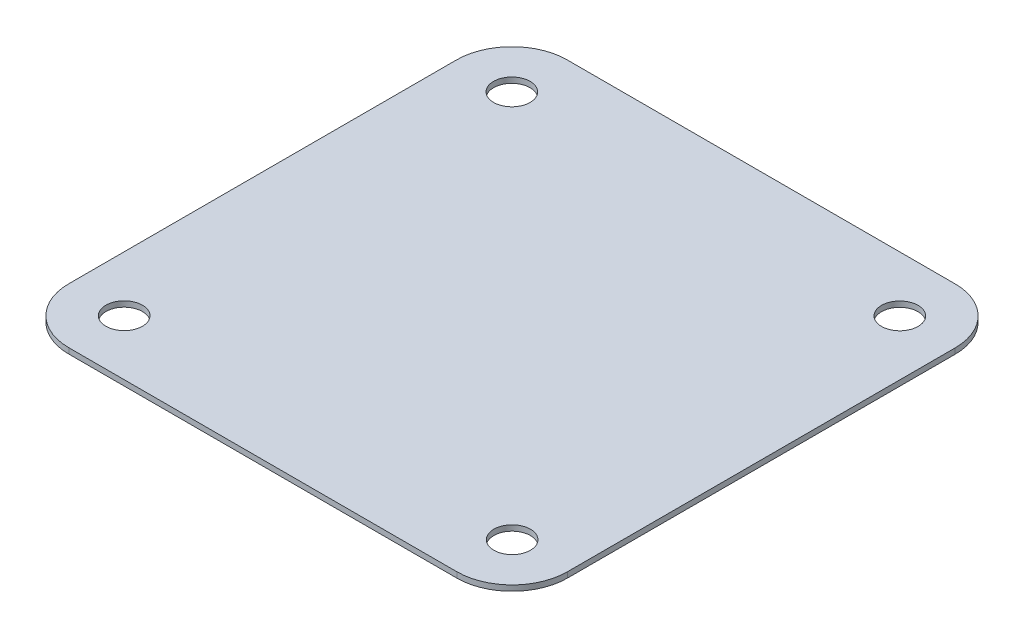
ISO-10303-21;
HEADER;
FILE_DESCRIPTION(('STEP AP214'),'2;1');
FILE_NAME('part.step','',(''),(''),'','','');
FILE_SCHEMA(('AUTOMOTIVE_DESIGN { 1 0 10303 214 1 1 1 1 }'));
ENDSEC;
DATA;
#1=APPLICATION_CONTEXT('core data for automotive mechanical design processes');
#2=APPLICATION_PROTOCOL_DEFINITION('international standard','automotive_design',2000,#1);
#3=PRODUCT_CONTEXT('',#1,'mechanical');
#4=PRODUCT('Part','Part','',(#3));
#5=PRODUCT_RELATED_PRODUCT_CATEGORY('part','',(#4));
#6=PRODUCT_DEFINITION_FORMATION('','',#4);
#7=PRODUCT_DEFINITION_CONTEXT('part definition',#1,'design');
#8=PRODUCT_DEFINITION('design','',#6,#7);
#9=PRODUCT_DEFINITION_SHAPE('','',#8);
#10=(LENGTH_UNIT() NAMED_UNIT(*) SI_UNIT(.MILLI.,.METRE.));
#11=(NAMED_UNIT(*) PLANE_ANGLE_UNIT() SI_UNIT($,.RADIAN.));
#12=(NAMED_UNIT(*) SI_UNIT($,.STERADIAN.) SOLID_ANGLE_UNIT());
#13=UNCERTAINTY_MEASURE_WITH_UNIT(LENGTH_MEASURE(1.E-05),#10,'distance_accuracy_value','');
#14=(GEOMETRIC_REPRESENTATION_CONTEXT(3) GLOBAL_UNCERTAINTY_ASSIGNED_CONTEXT((#13)) GLOBAL_UNIT_ASSIGNED_CONTEXT((#10,
#11,#12)) REPRESENTATION_CONTEXT('',''));
#15=CARTESIAN_POINT('',(0.,0.,0.));
#16=DIRECTION('',(0.,0.,1.));
#17=DIRECTION('',(1.,0.,0.));
#18=AXIS2_PLACEMENT_3D('',#15,#16,#17);
#19=CARTESIAN_POINT('',(-17.5126870222207,60.,17.5));
#20=DIRECTION('',(0.,-1.,0.));
#21=DIRECTION('',(0.,0.,-1.));
#22=AXIS2_PLACEMENT_3D('',#19,#20,#21);
#23=CYLINDRICAL_SURFACE('',#22,5.);
#24=CARTESIAN_POINT('',(-17.5126870222207,59.5,17.5));
#25=DIRECTION('',(0.,1.,0.));
#26=DIRECTION('',(0.,0.,1.));
#27=AXIS2_PLACEMENT_3D('',#24,#25,#26);
#28=CIRCLE('',#27,5.);
#29=CARTESIAN_POINT('',(-17.5126870222207,59.5,22.5));
#30=VERTEX_POINT('',#29);
#31=CARTESIAN_POINT('',(-22.5126870222207,59.5,17.5));
#32=VERTEX_POINT('',#31);
#33=EDGE_CURVE('E104',#30,#32,#28,.F.);
#34=ORIENTED_EDGE('',*,*,#33,.F.);
#35=DIRECTION('',(0.,-1.,0.));
#36=VECTOR('',#35,1.);
#37=CARTESIAN_POINT('',(-17.5126870222207,60.,22.5));
#38=LINE('',#37,#36);
#39=CARTESIAN_POINT('',(-17.5126870222207,60.,22.5));
#40=VERTEX_POINT('',#39);
#41=EDGE_CURVE('E115',#40,#30,#38,.T.);
#42=ORIENTED_EDGE('',*,*,#41,.F.);
#43=CARTESIAN_POINT('',(-17.5126870222207,60.,17.5));
#44=DIRECTION('',(0.,-1.,0.));
#45=DIRECTION('',(0.,0.,-1.));
#46=AXIS2_PLACEMENT_3D('',#43,#44,#45);
#47=CIRCLE('',#46,5.);
#48=CARTESIAN_POINT('',(-22.5126870222207,60.,17.5));
#49=VERTEX_POINT('',#48);
#50=EDGE_CURVE('E11',#49,#40,#47,.F.);
#51=ORIENTED_EDGE('',*,*,#50,.F.);
#52=DIRECTION('',(0.,-1.,0.));
#53=VECTOR('',#52,1.);
#54=CARTESIAN_POINT('',(-22.5126870222207,60.,17.5));
#55=LINE('',#54,#53);
#56=EDGE_CURVE('E50',#32,#49,#55,.F.);
#57=ORIENTED_EDGE('',*,*,#56,.F.);
#58=EDGE_LOOP('',(#34,#42,#51,#57));
#59=FACE_BOUND('',#58,.T.);
#60=ADVANCED_FACE('F39',(#59),#23,.T.);
#61=CARTESIAN_POINT('',(17.5126870222207,60.,17.5));
#62=DIRECTION('',(0.,-1.,0.));
#63=DIRECTION('',(0.,0.,-1.));
#64=AXIS2_PLACEMENT_3D('',#61,#62,#63);
#65=CYLINDRICAL_SURFACE('',#64,5.);
#66=CARTESIAN_POINT('',(17.5126870222207,59.5,17.5));
#67=DIRECTION('',(0.,1.,0.));
#68=DIRECTION('',(0.,0.,1.));
#69=AXIS2_PLACEMENT_3D('',#66,#67,#68);
#70=CIRCLE('',#69,5.);
#71=CARTESIAN_POINT('',(22.5126870222207,59.5,17.5));
#72=VERTEX_POINT('',#71);
#73=CARTESIAN_POINT('',(17.5126870222207,59.5,22.5));
#74=VERTEX_POINT('',#73);
#75=EDGE_CURVE('E53',#72,#74,#70,.F.);
#76=ORIENTED_EDGE('',*,*,#75,.F.);
#77=DIRECTION('',(0.,-1.,0.));
#78=VECTOR('',#77,1.);
#79=CARTESIAN_POINT('',(22.5126870222207,60.,17.5));
#80=LINE('',#79,#78);
#81=CARTESIAN_POINT('',(22.5126870222207,60.,17.5));
#82=VERTEX_POINT('',#81);
#83=EDGE_CURVE('E126',#82,#72,#80,.T.);
#84=ORIENTED_EDGE('',*,*,#83,.F.);
#85=CARTESIAN_POINT('',(17.5126870222207,60.,17.5));
#86=DIRECTION('',(0.,-1.,0.));
#87=DIRECTION('',(0.,0.,-1.));
#88=AXIS2_PLACEMENT_3D('',#85,#86,#87);
#89=CIRCLE('',#88,5.);
#90=CARTESIAN_POINT('',(17.5126870222207,60.,22.5));
#91=VERTEX_POINT('',#90);
#92=EDGE_CURVE('E118',#91,#82,#89,.F.);
#93=ORIENTED_EDGE('',*,*,#92,.F.);
#94=DIRECTION('',(0.,-1.,0.));
#95=VECTOR('',#94,1.);
#96=CARTESIAN_POINT('',(17.5126870222207,60.,22.5));
#97=LINE('',#96,#95);
#98=EDGE_CURVE('E125',#74,#91,#97,.F.);
#99=ORIENTED_EDGE('',*,*,#98,.F.);
#100=EDGE_LOOP('',(#76,#84,#93,#99));
#101=FACE_BOUND('',#100,.T.);
#102=ADVANCED_FACE('F205',(#101),#65,.T.);
#103=CARTESIAN_POINT('',(-17.5126870222207,60.,-17.5));
#104=DIRECTION('',(0.,1.,0.));
#105=DIRECTION('',(0.,0.,1.));
#106=AXIS2_PLACEMENT_3D('',#103,#104,#105);
#107=CYLINDRICAL_SURFACE('',#106,5.);
#108=CARTESIAN_POINT('',(-17.5126870222207,59.5,-17.5));
#109=DIRECTION('',(0.,1.,0.));
#110=DIRECTION('',(0.,0.,1.));
#111=AXIS2_PLACEMENT_3D('',#108,#109,#110);
#112=CIRCLE('',#111,5.);
#113=CARTESIAN_POINT('',(-22.5126870222207,59.5,-17.5));
#114=VERTEX_POINT('',#113);
#115=CARTESIAN_POINT('',(-17.5126870222207,59.5,-22.5));
#116=VERTEX_POINT('',#115);
#117=EDGE_CURVE('E166',#114,#116,#112,.F.);
#118=ORIENTED_EDGE('',*,*,#117,.F.);
#119=DIRECTION('',(0.,1.,0.));
#120=VECTOR('',#119,1.);
#121=CARTESIAN_POINT('',(-22.5126870222207,60.,-17.5));
#122=LINE('',#121,#120);
#123=CARTESIAN_POINT('',(-22.5126870222207,60.,-17.5));
#124=VERTEX_POINT('',#123);
#125=EDGE_CURVE('E131',#124,#114,#122,.F.);
#126=ORIENTED_EDGE('',*,*,#125,.F.);
#127=CARTESIAN_POINT('',(-17.5126870222207,60.,-17.5));
#128=DIRECTION('',(0.,-1.,0.));
#129=DIRECTION('',(0.,0.,-1.));
#130=AXIS2_PLACEMENT_3D('',#127,#128,#129);
#131=CIRCLE('',#130,5.);
#132=CARTESIAN_POINT('',(-17.5126870222207,60.,-22.5));
#133=VERTEX_POINT('',#132);
#134=EDGE_CURVE('E128',#133,#124,#131,.F.);
#135=ORIENTED_EDGE('',*,*,#134,.F.);
#136=DIRECTION('',(0.,1.,0.));
#137=VECTOR('',#136,1.);
#138=CARTESIAN_POINT('',(-17.5126870222207,60.,-22.5));
#139=LINE('',#138,#137);
#140=EDGE_CURVE('E133',#116,#133,#139,.T.);
#141=ORIENTED_EDGE('',*,*,#140,.F.);
#142=EDGE_LOOP('',(#118,#126,#135,#141));
#143=FACE_BOUND('',#142,.T.);
#144=ADVANCED_FACE('F206',(#143),#107,.T.);
#145=CARTESIAN_POINT('',(17.5126870222207,60.,-17.5));
#146=DIRECTION('',(0.,-1.,0.));
#147=DIRECTION('',(0.,0.,-1.));
#148=AXIS2_PLACEMENT_3D('',#145,#146,#147);
#149=CYLINDRICAL_SURFACE('',#148,5.);
#150=CARTESIAN_POINT('',(17.5126870222207,59.5,-17.5));
#151=DIRECTION('',(0.,1.,0.));
#152=DIRECTION('',(0.,0.,1.));
#153=AXIS2_PLACEMENT_3D('',#150,#151,#152);
#154=CIRCLE('',#153,5.);
#155=CARTESIAN_POINT('',(17.5126870222207,59.5,-22.5));
#156=VERTEX_POINT('',#155);
#157=CARTESIAN_POINT('',(22.5126870222207,59.5,-17.5));
#158=VERTEX_POINT('',#157);
#159=EDGE_CURVE('E167',#156,#158,#154,.F.);
#160=ORIENTED_EDGE('',*,*,#159,.F.);
#161=DIRECTION('',(0.,-1.,0.));
#162=VECTOR('',#161,1.);
#163=CARTESIAN_POINT('',(17.5126870222207,60.,-22.5));
#164=LINE('',#163,#162);
#165=CARTESIAN_POINT('',(17.5126870222207,60.,-22.5));
#166=VERTEX_POINT('',#165);
#167=EDGE_CURVE('E138',#166,#156,#164,.T.);
#168=ORIENTED_EDGE('',*,*,#167,.F.);
#169=CARTESIAN_POINT('',(17.5126870222207,60.,-17.5));
#170=DIRECTION('',(0.,-1.,0.));
#171=DIRECTION('',(0.,0.,-1.));
#172=AXIS2_PLACEMENT_3D('',#169,#170,#171);
#173=CIRCLE('',#172,5.);
#174=CARTESIAN_POINT('',(22.5126870222207,60.,-17.5));
#175=VERTEX_POINT('',#174);
#176=EDGE_CURVE('E137',#175,#166,#173,.F.);
#177=ORIENTED_EDGE('',*,*,#176,.F.);
#178=DIRECTION('',(0.,-1.,0.));
#179=VECTOR('',#178,1.);
#180=CARTESIAN_POINT('',(22.5126870222207,60.,-17.5));
#181=LINE('',#180,#179);
#182=EDGE_CURVE('E140',#158,#175,#181,.F.);
#183=ORIENTED_EDGE('',*,*,#182,.F.);
#184=EDGE_LOOP('',(#160,#168,#177,#183));
#185=FACE_BOUND('',#184,.T.);
#186=ADVANCED_FACE('F212',(#185),#149,.T.);
#187=CARTESIAN_POINT('',(22.5126870222207,60.,22.5));
#188=DIRECTION('',(-1.,0.,0.));
#189=DIRECTION('',(0.,0.,1.));
#190=AXIS2_PLACEMENT_3D('',#187,#188,#189);
#191=PLANE('',#190);
#192=ORIENTED_EDGE('',*,*,#83,.T.);
#193=DIRECTION('',(0.,0.,-1.));
#194=VECTOR('',#193,1.);
#195=CARTESIAN_POINT('',(22.5126870222207,59.5,22.5));
#196=LINE('',#195,#194);
#197=EDGE_CURVE('E175',#72,#158,#196,.T.);
#198=ORIENTED_EDGE('',*,*,#197,.T.);
#199=ORIENTED_EDGE('',*,*,#182,.T.);
#200=DIRECTION('',(0.,0.,-1.));
#201=VECTOR('',#200,1.);
#202=CARTESIAN_POINT('',(22.5126870222207,60.,22.5));
#203=LINE('',#202,#201);
#204=EDGE_CURVE('E149',#82,#175,#203,.T.);
#205=ORIENTED_EDGE('',*,*,#204,.F.);
#206=EDGE_LOOP('',(#192,#198,#199,#205));
#207=FACE_BOUND('',#206,.T.);
#208=ADVANCED_FACE('F218',(#207),#191,.F.);
#209=CARTESIAN_POINT('',(-22.5126870222207,60.,-22.5));
#210=DIRECTION('',(0.,0.,1.));
#211=DIRECTION('',(1.,0.,0.));
#212=AXIS2_PLACEMENT_3D('',#209,#210,#211);
#213=PLANE('',#212);
#214=ORIENTED_EDGE('',*,*,#167,.T.);
#215=DIRECTION('',(-1.,0.,0.));
#216=VECTOR('',#215,1.);
#217=CARTESIAN_POINT('',(-22.5126870222207,59.5,-22.5));
#218=LINE('',#217,#216);
#219=EDGE_CURVE('E164',#156,#116,#218,.T.);
#220=ORIENTED_EDGE('',*,*,#219,.T.);
#221=ORIENTED_EDGE('',*,*,#140,.T.);
#222=DIRECTION('',(-1.,0.,0.));
#223=VECTOR('',#222,1.);
#224=CARTESIAN_POINT('',(-22.5126870222207,60.,-22.5));
#225=LINE('',#224,#223);
#226=EDGE_CURVE('E150',#166,#133,#225,.T.);
#227=ORIENTED_EDGE('',*,*,#226,.F.);
#228=EDGE_LOOP('',(#214,#220,#221,#227));
#229=FACE_BOUND('',#228,.T.);
#230=ADVANCED_FACE('F225',(#229),#213,.F.);
#231=CARTESIAN_POINT('',(-22.5126870222207,60.,22.5));
#232=DIRECTION('',(1.,0.,0.));
#233=DIRECTION('',(0.,0.,-1.));
#234=AXIS2_PLACEMENT_3D('',#231,#232,#233);
#235=PLANE('',#234);
#236=ORIENTED_EDGE('',*,*,#125,.T.);
#237=DIRECTION('',(0.,0.,1.));
#238=VECTOR('',#237,1.);
#239=CARTESIAN_POINT('',(-22.5126870222207,59.5,22.5));
#240=LINE('',#239,#238);
#241=EDGE_CURVE('E112',#114,#32,#240,.T.);
#242=ORIENTED_EDGE('',*,*,#241,.T.);
#243=ORIENTED_EDGE('',*,*,#56,.T.);
#244=DIRECTION('',(0.,0.,1.));
#245=VECTOR('',#244,1.);
#246=CARTESIAN_POINT('',(-22.5126870222207,60.,22.5));
#247=LINE('',#246,#245);
#248=EDGE_CURVE('E144',#124,#49,#247,.T.);
#249=ORIENTED_EDGE('',*,*,#248,.F.);
#250=EDGE_LOOP('',(#236,#242,#243,#249));
#251=FACE_BOUND('',#250,.T.);
#252=ADVANCED_FACE('F227',(#251),#235,.F.);
#253=CARTESIAN_POINT('',(-22.5126870222207,60.,22.5));
#254=DIRECTION('',(0.,0.,-1.));
#255=DIRECTION('',(-1.,0.,0.));
#256=AXIS2_PLACEMENT_3D('',#253,#254,#255);
#257=PLANE('',#256);
#258=ORIENTED_EDGE('',*,*,#41,.T.);
#259=DIRECTION('',(1.,0.,0.));
#260=VECTOR('',#259,1.);
#261=CARTESIAN_POINT('',(-22.5126870222207,59.5,22.5));
#262=LINE('',#261,#260);
#263=EDGE_CURVE('E103',#30,#74,#262,.T.);
#264=ORIENTED_EDGE('',*,*,#263,.T.);
#265=ORIENTED_EDGE('',*,*,#98,.T.);
#266=DIRECTION('',(1.,0.,0.));
#267=VECTOR('',#266,1.);
#268=CARTESIAN_POINT('',(-22.5126870222207,60.,22.5));
#269=LINE('',#268,#267);
#270=EDGE_CURVE('E117',#40,#91,#269,.T.);
#271=ORIENTED_EDGE('',*,*,#270,.F.);
#272=EDGE_LOOP('',(#258,#264,#265,#271));
#273=FACE_BOUND('',#272,.T.);
#274=ADVANCED_FACE('F116',(#273),#257,.F.);
#275=CARTESIAN_POINT('',(0.,60.,0.));
#276=DIRECTION('',(0.,-1.,0.));
#277=DIRECTION('',(0.,0.,-1.));
#278=AXIS2_PLACEMENT_3D('',#275,#276,#277);
#279=PLANE('',#278);
#280=CARTESIAN_POINT('',(17.5126870222207,60.,17.5));
#281=DIRECTION('',(0.,1.,0.));
#282=DIRECTION('',(0.,0.,-1.));
#283=AXIS2_PLACEMENT_3D('',#280,#281,#282);
#284=CIRCLE('',#283,1.65);
#285=CARTESIAN_POINT('',(17.5126870222207,60.,15.85));
#286=VERTEX_POINT('',#285);
#287=EDGE_CURVE('E162',#286,#286,#284,.T.);
#288=ORIENTED_EDGE('',*,*,#287,.F.);
#289=EDGE_LOOP('',(#288));
#290=FACE_BOUND('',#289,.T.);
#291=CARTESIAN_POINT('',(17.5126870222207,60.,-17.5));
#292=DIRECTION('',(0.,-1.,0.));
#293=DIRECTION('',(0.,0.,1.));
#294=AXIS2_PLACEMENT_3D('',#291,#292,#293);
#295=CIRCLE('',#294,1.65);
#296=CARTESIAN_POINT('',(17.5126870222207,60.,-15.85));
#297=VERTEX_POINT('',#296);
#298=EDGE_CURVE('E156',#297,#297,#295,.T.);
#299=ORIENTED_EDGE('',*,*,#298,.T.);
#300=EDGE_LOOP('',(#299));
#301=FACE_BOUND('',#300,.T.);
#302=CARTESIAN_POINT('',(-17.5126870222207,60.,17.5));
#303=DIRECTION('',(0.,-1.,0.));
#304=DIRECTION('',(0.,0.,-1.));
#305=AXIS2_PLACEMENT_3D('',#302,#303,#304);
#306=CIRCLE('',#305,1.65);
#307=CARTESIAN_POINT('',(-17.5126870222207,60.,15.85));
#308=VERTEX_POINT('',#307);
#309=EDGE_CURVE('E157',#308,#308,#306,.T.);
#310=ORIENTED_EDGE('',*,*,#309,.T.);
#311=EDGE_LOOP('',(#310));
#312=FACE_BOUND('',#311,.T.);
#313=CARTESIAN_POINT('',(-17.5126870222207,60.,-17.5));
#314=DIRECTION('',(0.,1.,0.));
#315=DIRECTION('',(0.,0.,1.));
#316=AXIS2_PLACEMENT_3D('',#313,#314,#315);
#317=CIRCLE('',#316,1.65);
#318=CARTESIAN_POINT('',(-17.5126870222207,60.,-15.85));
#319=VERTEX_POINT('',#318);
#320=EDGE_CURVE('E154',#319,#319,#317,.T.);
#321=ORIENTED_EDGE('',*,*,#320,.F.);
#322=EDGE_LOOP('',(#321));
#323=FACE_BOUND('',#322,.T.);
#324=ORIENTED_EDGE('',*,*,#248,.T.);
#325=ORIENTED_EDGE('',*,*,#50,.T.);
#326=ORIENTED_EDGE('',*,*,#270,.T.);
#327=ORIENTED_EDGE('',*,*,#92,.T.);
#328=ORIENTED_EDGE('',*,*,#204,.T.);
#329=ORIENTED_EDGE('',*,*,#176,.T.);
#330=ORIENTED_EDGE('',*,*,#226,.T.);
#331=ORIENTED_EDGE('',*,*,#134,.T.);
#332=EDGE_LOOP('',(#324,#325,#326,#327,#328,#329,#330,#331));
#333=FACE_BOUND('',#332,.T.);
#334=ADVANCED_FACE('F231',(#290,#301,#312,#323,#333),#279,.F.);
#335=CARTESIAN_POINT('',(-17.5126870222207,55.,-17.5));
#336=DIRECTION('',(0.,1.,0.));
#337=DIRECTION('',(0.,0.,1.));
#338=AXIS2_PLACEMENT_3D('',#335,#336,#337);
#339=CYLINDRICAL_SURFACE('',#338,1.65);
#340=CARTESIAN_POINT('',(-17.5126870222207,59.5,-17.5));
#341=DIRECTION('',(0.,1.,0.));
#342=DIRECTION('',(0.,0.,1.));
#343=AXIS2_PLACEMENT_3D('',#340,#341,#342);
#344=CIRCLE('',#343,1.65);
#345=CARTESIAN_POINT('',(-17.5126870222207,59.5,-15.85));
#346=VERTEX_POINT('',#345);
#347=EDGE_CURVE('E108',#346,#346,#344,.F.);
#348=ORIENTED_EDGE('',*,*,#347,.T.);
#349=EDGE_LOOP('',(#348));
#350=FACE_BOUND('',#349,.T.);
#351=ORIENTED_EDGE('',*,*,#320,.T.);
#352=EDGE_LOOP('',(#351));
#353=FACE_BOUND('',#352,.T.);
#354=ADVANCED_FACE('F232',(#350,#353),#339,.F.);
#355=CARTESIAN_POINT('',(-17.5126870222207,55.,17.5));
#356=DIRECTION('',(0.,1.,0.));
#357=DIRECTION('',(0.,0.,1.));
#358=AXIS2_PLACEMENT_3D('',#355,#356,#357);
#359=CYLINDRICAL_SURFACE('',#358,1.65);
#360=CARTESIAN_POINT('',(-17.5126870222207,59.5,17.5));
#361=DIRECTION('',(0.,1.,0.));
#362=DIRECTION('',(0.,0.,1.));
#363=AXIS2_PLACEMENT_3D('',#360,#361,#362);
#364=CIRCLE('',#363,1.65);
#365=CARTESIAN_POINT('',(-17.5126870222207,59.5,19.15));
#366=VERTEX_POINT('',#365);
#367=EDGE_CURVE('E177',#366,#366,#364,.T.);
#368=ORIENTED_EDGE('',*,*,#367,.F.);
#369=EDGE_LOOP('',(#368));
#370=FACE_BOUND('',#369,.T.);
#371=ORIENTED_EDGE('',*,*,#309,.F.);
#372=EDGE_LOOP('',(#371));
#373=FACE_BOUND('',#372,.T.);
#374=ADVANCED_FACE('F237',(#370,#373),#359,.F.);
#375=CARTESIAN_POINT('',(17.5126870222207,55.,-17.5));
#376=DIRECTION('',(0.,1.,0.));
#377=DIRECTION('',(0.,0.,1.));
#378=AXIS2_PLACEMENT_3D('',#375,#376,#377);
#379=CYLINDRICAL_SURFACE('',#378,1.65);
#380=CARTESIAN_POINT('',(17.5126870222207,59.5,-17.5));
#381=DIRECTION('',(0.,1.,0.));
#382=DIRECTION('',(0.,0.,1.));
#383=AXIS2_PLACEMENT_3D('',#380,#381,#382);
#384=CIRCLE('',#383,1.65);
#385=CARTESIAN_POINT('',(17.5126870222207,59.5,-15.85));
#386=VERTEX_POINT('',#385);
#387=EDGE_CURVE('E185',#386,#386,#384,.T.);
#388=ORIENTED_EDGE('',*,*,#387,.F.);
#389=EDGE_LOOP('',(#388));
#390=FACE_BOUND('',#389,.T.);
#391=ORIENTED_EDGE('',*,*,#298,.F.);
#392=EDGE_LOOP('',(#391));
#393=FACE_BOUND('',#392,.T.);
#394=ADVANCED_FACE('F199',(#390,#393),#379,.F.);
#395=CARTESIAN_POINT('',(17.5126870222207,55.,17.5));
#396=DIRECTION('',(0.,1.,0.));
#397=DIRECTION('',(0.,0.,1.));
#398=AXIS2_PLACEMENT_3D('',#395,#396,#397);
#399=CYLINDRICAL_SURFACE('',#398,1.65);
#400=CARTESIAN_POINT('',(17.5126870222207,59.5,17.5));
#401=DIRECTION('',(0.,1.,0.));
#402=DIRECTION('',(0.,0.,1.));
#403=AXIS2_PLACEMENT_3D('',#400,#401,#402);
#404=CIRCLE('',#403,1.65);
#405=CARTESIAN_POINT('',(17.5126870222207,59.5,19.15));
#406=VERTEX_POINT('',#405);
#407=EDGE_CURVE('E45',#406,#406,#404,.F.);
#408=ORIENTED_EDGE('',*,*,#407,.T.);
#409=EDGE_LOOP('',(#408));
#410=FACE_BOUND('',#409,.T.);
#411=ORIENTED_EDGE('',*,*,#287,.T.);
#412=EDGE_LOOP('',(#411));
#413=FACE_BOUND('',#412,.T.);
#414=ADVANCED_FACE('F186',(#410,#413),#399,.F.);
#415=CARTESIAN_POINT('',(0.,59.5,0.));
#416=DIRECTION('',(0.,1.,0.));
#417=DIRECTION('',(0.,0.,1.));
#418=AXIS2_PLACEMENT_3D('',#415,#416,#417);
#419=PLANE('',#418);
#420=ORIENTED_EDGE('',*,*,#347,.F.);
#421=EDGE_LOOP('',(#420));
#422=FACE_BOUND('',#421,.T.);
#423=ORIENTED_EDGE('',*,*,#367,.T.);
#424=EDGE_LOOP('',(#423));
#425=FACE_BOUND('',#424,.T.);
#426=ORIENTED_EDGE('',*,*,#387,.T.);
#427=EDGE_LOOP('',(#426));
#428=FACE_BOUND('',#427,.T.);
#429=ORIENTED_EDGE('',*,*,#407,.F.);
#430=EDGE_LOOP('',(#429));
#431=FACE_BOUND('',#430,.T.);
#432=ORIENTED_EDGE('',*,*,#159,.T.);
#433=ORIENTED_EDGE('',*,*,#197,.F.);
#434=ORIENTED_EDGE('',*,*,#75,.T.);
#435=ORIENTED_EDGE('',*,*,#263,.F.);
#436=ORIENTED_EDGE('',*,*,#33,.T.);
#437=ORIENTED_EDGE('',*,*,#241,.F.);
#438=ORIENTED_EDGE('',*,*,#117,.T.);
#439=ORIENTED_EDGE('',*,*,#219,.F.);
#440=EDGE_LOOP('',(#432,#433,#434,#435,#436,#437,#438,#439));
#441=FACE_BOUND('',#440,.T.);
#442=ADVANCED_FACE('F101',(#422,#425,#428,#431,#441),#419,.F.);
#443=CLOSED_SHELL('',(#60,#102,#144,#186,#208,#230,#252,#274,#334,#354,#374,#394,#414,#442));
#444=MANIFOLD_SOLID_BREP('B2',#443);
#445=ADVANCED_BREP_SHAPE_REPRESENTATION('',(#18,#444),#14);
#446=SHAPE_DEFINITION_REPRESENTATION(#9,#445);
ENDSEC;
END-ISO-10303-21;
